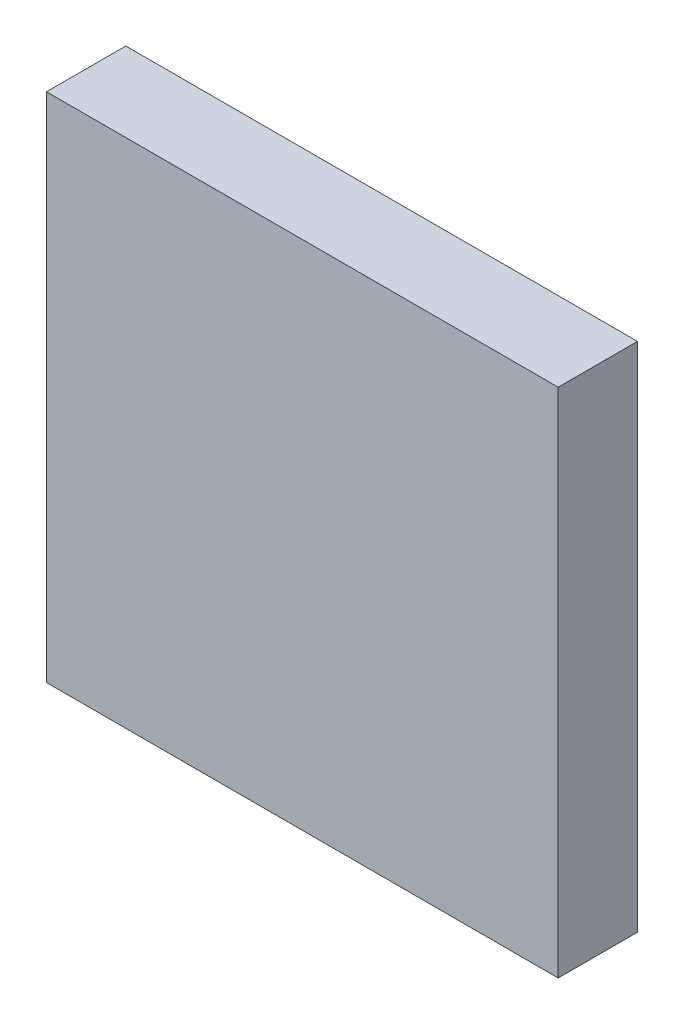
ISO-10303-21;
HEADER;
FILE_DESCRIPTION(('STEP AP214'),'2;1');
FILE_NAME('part.step','',(''),(''),'','','');
FILE_SCHEMA(('AUTOMOTIVE_DESIGN { 1 0 10303 214 1 1 1 1 }'));
ENDSEC;
DATA;
#1=APPLICATION_CONTEXT('core data for automotive mechanical design processes');
#2=APPLICATION_PROTOCOL_DEFINITION('international standard','automotive_design',2000,#1);
#3=PRODUCT_CONTEXT('',#1,'mechanical');
#4=PRODUCT('Part','Part','',(#3));
#5=PRODUCT_RELATED_PRODUCT_CATEGORY('part','',(#4));
#6=PRODUCT_DEFINITION_FORMATION('','',#4);
#7=PRODUCT_DEFINITION_CONTEXT('part definition',#1,'design');
#8=PRODUCT_DEFINITION('design','',#6,#7);
#9=PRODUCT_DEFINITION_SHAPE('','',#8);
#10=(LENGTH_UNIT() NAMED_UNIT(*) SI_UNIT(.MILLI.,.METRE.));
#11=(NAMED_UNIT(*) PLANE_ANGLE_UNIT() SI_UNIT($,.RADIAN.));
#12=(NAMED_UNIT(*) SI_UNIT($,.STERADIAN.) SOLID_ANGLE_UNIT());
#13=UNCERTAINTY_MEASURE_WITH_UNIT(LENGTH_MEASURE(1.E-05),#10,'distance_accuracy_value','');
#14=(GEOMETRIC_REPRESENTATION_CONTEXT(3) GLOBAL_UNCERTAINTY_ASSIGNED_CONTEXT((#13)) GLOBAL_UNIT_ASSIGNED_CONTEXT((#10,
#11,#12)) REPRESENTATION_CONTEXT('',''));
#15=CARTESIAN_POINT('',(0.,0.,0.));
#16=DIRECTION('',(0.,0.,1.));
#17=DIRECTION('',(1.,0.,0.));
#18=AXIS2_PLACEMENT_3D('',#15,#16,#17);
#19=CARTESIAN_POINT('',(-5.00000016,-5.00000016,1.54999944));
#20=DIRECTION('',(0.,0.,-1.));
#21=DIRECTION('',(-1.,0.,0.));
#22=AXIS2_PLACEMENT_3D('',#19,#20,#21);
#23=PLANE('',#22);
#24=DIRECTION('',(0.,1.,0.));
#25=VECTOR('',#24,1.);
#26=CARTESIAN_POINT('',(5.00000016,-5.00000016,1.54999944));
#27=LINE('',#26,#25);
#28=CARTESIAN_POINT('',(5.00000016,-5.00000016,1.54999944));
#29=VERTEX_POINT('',#28);
#30=CARTESIAN_POINT('',(5.00000016,5.00000016,1.54999944));
#31=VERTEX_POINT('',#30);
#32=EDGE_CURVE('E56',#29,#31,#27,.T.);
#33=ORIENTED_EDGE('',*,*,#32,.T.);
#34=DIRECTION('',(1.,0.,0.));
#35=VECTOR('',#34,1.);
#36=CARTESIAN_POINT('',(5.00000016,5.00000016,1.54999944));
#37=LINE('',#36,#35);
#38=CARTESIAN_POINT('',(-5.00000016,5.00000016,1.54999944));
#39=VERTEX_POINT('',#38);
#40=EDGE_CURVE('E58',#31,#39,#37,.F.);
#41=ORIENTED_EDGE('',*,*,#40,.T.);
#42=DIRECTION('',(0.,1.,0.));
#43=VECTOR('',#42,1.);
#44=CARTESIAN_POINT('',(-5.00000016,5.00000016,1.54999944));
#45=LINE('',#44,#43);
#46=CARTESIAN_POINT('',(-5.00000016,-5.00000016,1.54999944));
#47=VERTEX_POINT('',#46);
#48=EDGE_CURVE('E21',#39,#47,#45,.F.);
#49=ORIENTED_EDGE('',*,*,#48,.T.);
#50=DIRECTION('',(1.,0.,0.));
#51=VECTOR('',#50,1.);
#52=CARTESIAN_POINT('',(-5.00000016,-5.00000016,1.54999944));
#53=LINE('',#52,#51);
#54=EDGE_CURVE('E81',#47,#29,#53,.T.);
#55=ORIENTED_EDGE('',*,*,#54,.T.);
#56=EDGE_LOOP('',(#33,#41,#49,#55));
#57=FACE_BOUND('',#56,.T.);
#58=ADVANCED_FACE('F18',(#57),#23,.F.);
#59=CARTESIAN_POINT('',(-5.00000016,5.00000016,0.));
#60=DIRECTION('',(1.,0.,0.));
#61=DIRECTION('',(0.,0.,-1.));
#62=AXIS2_PLACEMENT_3D('',#59,#60,#61);
#63=PLANE('',#62);
#64=DIRECTION('',(0.,0.,1.));
#65=VECTOR('',#64,1.);
#66=CARTESIAN_POINT('',(-5.00000016,-5.00000016,0.));
#67=LINE('',#66,#65);
#68=CARTESIAN_POINT('',(-5.00000016,-5.00000016,0.));
#69=VERTEX_POINT('',#68);
#70=EDGE_CURVE('E69',#69,#47,#67,.T.);
#71=ORIENTED_EDGE('',*,*,#70,.T.);
#72=ORIENTED_EDGE('',*,*,#48,.F.);
#73=DIRECTION('',(0.,0.,-1.));
#74=VECTOR('',#73,1.);
#75=CARTESIAN_POINT('',(-5.00000016,5.00000016,0.));
#76=LINE('',#75,#74);
#77=CARTESIAN_POINT('',(-5.00000016,5.00000016,0.));
#78=VERTEX_POINT('',#77);
#79=EDGE_CURVE('E64',#39,#78,#76,.T.);
#80=ORIENTED_EDGE('',*,*,#79,.T.);
#81=DIRECTION('',(0.,1.,0.));
#82=VECTOR('',#81,1.);
#83=CARTESIAN_POINT('',(-5.00000016,-5.00000016,0.));
#84=LINE('',#83,#82);
#85=EDGE_CURVE('E84',#69,#78,#84,.T.);
#86=ORIENTED_EDGE('',*,*,#85,.F.);
#87=EDGE_LOOP('',(#71,#72,#80,#86));
#88=FACE_BOUND('',#87,.T.);
#89=ADVANCED_FACE('F66',(#88),#63,.F.);
#90=CARTESIAN_POINT('',(5.00000016,5.00000016,0.));
#91=DIRECTION('',(0.,-1.,0.));
#92=DIRECTION('',(0.,0.,-1.));
#93=AXIS2_PLACEMENT_3D('',#90,#91,#92);
#94=PLANE('',#93);
#95=ORIENTED_EDGE('',*,*,#79,.F.);
#96=ORIENTED_EDGE('',*,*,#40,.F.);
#97=DIRECTION('',(0.,0.,1.));
#98=VECTOR('',#97,1.);
#99=CARTESIAN_POINT('',(5.00000016,5.00000016,0.));
#100=LINE('',#99,#98);
#101=CARTESIAN_POINT('',(5.00000016,5.00000016,0.));
#102=VERTEX_POINT('',#101);
#103=EDGE_CURVE('E76',#31,#102,#100,.F.);
#104=ORIENTED_EDGE('',*,*,#103,.T.);
#105=DIRECTION('',(-1.,0.,0.));
#106=VECTOR('',#105,1.);
#107=CARTESIAN_POINT('',(-5.00000016,5.00000016,0.));
#108=LINE('',#107,#106);
#109=EDGE_CURVE('E73',#78,#102,#108,.F.);
#110=ORIENTED_EDGE('',*,*,#109,.F.);
#111=EDGE_LOOP('',(#95,#96,#104,#110));
#112=FACE_BOUND('',#111,.T.);
#113=ADVANCED_FACE('F71',(#112),#94,.F.);
#114=CARTESIAN_POINT('',(5.00000016,-5.00000016,0.));
#115=DIRECTION('',(-1.,0.,0.));
#116=DIRECTION('',(0.,0.,1.));
#117=AXIS2_PLACEMENT_3D('',#114,#115,#116);
#118=PLANE('',#117);
#119=ORIENTED_EDGE('',*,*,#103,.F.);
#120=ORIENTED_EDGE('',*,*,#32,.F.);
#121=DIRECTION('',(0.,0.,1.));
#122=VECTOR('',#121,1.);
#123=CARTESIAN_POINT('',(5.00000016,-5.00000016,0.));
#124=LINE('',#123,#122);
#125=CARTESIAN_POINT('',(5.00000016,-5.00000016,0.));
#126=VERTEX_POINT('',#125);
#127=EDGE_CURVE('E36',#29,#126,#124,.F.);
#128=ORIENTED_EDGE('',*,*,#127,.T.);
#129=DIRECTION('',(0.,1.,0.));
#130=VECTOR('',#129,1.);
#131=CARTESIAN_POINT('',(5.00000016,-5.00000016,0.));
#132=LINE('',#131,#130);
#133=EDGE_CURVE('E27',#102,#126,#132,.F.);
#134=ORIENTED_EDGE('',*,*,#133,.F.);
#135=EDGE_LOOP('',(#119,#120,#128,#134));
#136=FACE_BOUND('',#135,.T.);
#137=ADVANCED_FACE('F90',(#136),#118,.F.);
#138=CARTESIAN_POINT('',(-5.00000016,-5.00000016,0.));
#139=DIRECTION('',(0.,1.,0.));
#140=DIRECTION('',(0.,0.,1.));
#141=AXIS2_PLACEMENT_3D('',#138,#139,#140);
#142=PLANE('',#141);
#143=ORIENTED_EDGE('',*,*,#127,.F.);
#144=ORIENTED_EDGE('',*,*,#54,.F.);
#145=ORIENTED_EDGE('',*,*,#70,.F.);
#146=DIRECTION('',(-1.,0.,0.));
#147=VECTOR('',#146,1.);
#148=CARTESIAN_POINT('',(-5.00000016,-5.00000016,0.));
#149=LINE('',#148,#147);
#150=EDGE_CURVE('E11',#126,#69,#149,.T.);
#151=ORIENTED_EDGE('',*,*,#150,.F.);
#152=EDGE_LOOP('',(#143,#144,#145,#151));
#153=FACE_BOUND('',#152,.T.);
#154=ADVANCED_FACE('F92',(#153),#142,.F.);
#155=CARTESIAN_POINT('',(-5.00000016,-5.00000016,0.));
#156=DIRECTION('',(0.,0.,-1.));
#157=DIRECTION('',(-1.,0.,0.));
#158=AXIS2_PLACEMENT_3D('',#155,#156,#157);
#159=PLANE('',#158);
#160=ORIENTED_EDGE('',*,*,#133,.T.);
#161=ORIENTED_EDGE('',*,*,#150,.T.);
#162=ORIENTED_EDGE('',*,*,#85,.T.);
#163=ORIENTED_EDGE('',*,*,#109,.T.);
#164=EDGE_LOOP('',(#160,#161,#162,#163));
#165=FACE_BOUND('',#164,.T.);
#166=ADVANCED_FACE('F89',(#165),#159,.T.);
#167=CLOSED_SHELL('',(#58,#89,#113,#137,#154,#166));
#168=MANIFOLD_SOLID_BREP('B1',#167);
#169=ADVANCED_BREP_SHAPE_REPRESENTATION('',(#18,#168),#14);
#170=SHAPE_DEFINITION_REPRESENTATION(#9,#169);
ENDSEC;
END-ISO-10303-21;
